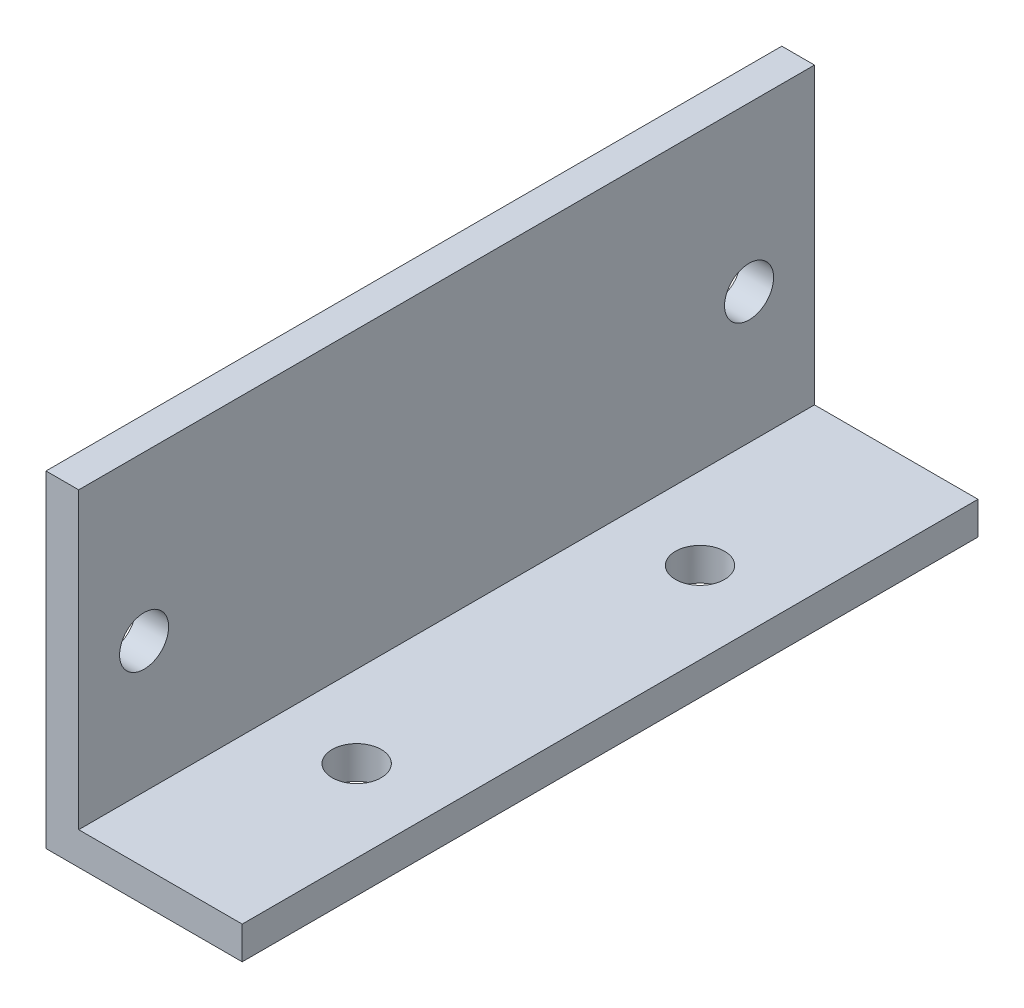
ISO-10303-21;
HEADER;
FILE_DESCRIPTION(('STEP AP214'),'2;1');
FILE_NAME('part.step','',(''),(''),'','','');
FILE_SCHEMA(('AUTOMOTIVE_DESIGN { 1 0 10303 214 1 1 1 1 }'));
ENDSEC;
DATA;
#1=APPLICATION_CONTEXT('core data for automotive mechanical design processes');
#2=APPLICATION_PROTOCOL_DEFINITION('international standard','automotive_design',2000,#1);
#3=PRODUCT_CONTEXT('',#1,'mechanical');
#4=PRODUCT('Part','Part','',(#3));
#5=PRODUCT_RELATED_PRODUCT_CATEGORY('part','',(#4));
#6=PRODUCT_DEFINITION_FORMATION('','',#4);
#7=PRODUCT_DEFINITION_CONTEXT('part definition',#1,'design');
#8=PRODUCT_DEFINITION('design','',#6,#7);
#9=PRODUCT_DEFINITION_SHAPE('','',#8);
#10=(LENGTH_UNIT() NAMED_UNIT(*) SI_UNIT(.MILLI.,.METRE.));
#11=(NAMED_UNIT(*) PLANE_ANGLE_UNIT() SI_UNIT($,.RADIAN.));
#12=(NAMED_UNIT(*) SI_UNIT($,.STERADIAN.) SOLID_ANGLE_UNIT());
#13=UNCERTAINTY_MEASURE_WITH_UNIT(LENGTH_MEASURE(1.E-05),#10,'distance_accuracy_value','');
#14=(GEOMETRIC_REPRESENTATION_CONTEXT(3) GLOBAL_UNCERTAINTY_ASSIGNED_CONTEXT((#13)) GLOBAL_UNIT_ASSIGNED_CONTEXT((#10,
#11,#12)) REPRESENTATION_CONTEXT('',''));
#15=CARTESIAN_POINT('',(0.,0.,0.));
#16=DIRECTION('',(0.,0.,1.));
#17=DIRECTION('',(1.,0.,0.));
#18=AXIS2_PLACEMENT_3D('',#15,#16,#17);
#19=CARTESIAN_POINT('',(-8.16000000000001,-3.80000000000001,45.));
#20=DIRECTION('',(1.,0.,0.));
#21=DIRECTION('',(0.,0.,-1.));
#22=AXIS2_PLACEMENT_3D('',#19,#20,#21);
#23=PLANE('',#22);
#24=CARTESIAN_POINT('',(-8.16000000000001,6.2,41.));
#25=DIRECTION('',(-1.,0.,0.));
#26=DIRECTION('',(0.,0.,-1.));
#27=AXIS2_PLACEMENT_3D('',#24,#25,#26);
#28=CIRCLE('',#27,1.5);
#29=CARTESIAN_POINT('',(-8.16000000000001,6.2,39.5));
#30=VERTEX_POINT('',#29);
#31=EDGE_CURVE('E143',#30,#30,#28,.T.);
#32=ORIENTED_EDGE('',*,*,#31,.F.);
#33=EDGE_LOOP('',(#32));
#34=FACE_BOUND('',#33,.T.);
#35=CARTESIAN_POINT('',(-8.16000000000001,6.19999999999999,4.));
#36=DIRECTION('',(-1.,0.,0.));
#37=DIRECTION('',(0.,0.,1.));
#38=AXIS2_PLACEMENT_3D('',#35,#36,#37);
#39=CIRCLE('',#38,1.5);
#40=CARTESIAN_POINT('',(-8.16000000000001,6.19999999999999,5.5));
#41=VERTEX_POINT('',#40);
#42=EDGE_CURVE('E140',#41,#41,#39,.T.);
#43=ORIENTED_EDGE('',*,*,#42,.F.);
#44=EDGE_LOOP('',(#43));
#45=FACE_BOUND('',#44,.T.);
#46=DIRECTION('',(0.,-1.,0.));
#47=VECTOR('',#46,1.);
#48=CARTESIAN_POINT('',(-8.16000000000001,-3.80000000000001,0.));
#49=LINE('',#48,#47);
#50=CARTESIAN_POINT('',(-8.16000000000001,16.2,0.));
#51=VERTEX_POINT('',#50);
#52=CARTESIAN_POINT('',(-8.16000000000001,-3.80000000000001,0.));
#53=VERTEX_POINT('',#52);
#54=EDGE_CURVE('E121',#51,#53,#49,.T.);
#55=ORIENTED_EDGE('',*,*,#54,.T.);
#56=DIRECTION('',(0.,0.,-1.));
#57=VECTOR('',#56,1.);
#58=CARTESIAN_POINT('',(-8.16000000000001,-3.80000000000001,45.));
#59=LINE('',#58,#57);
#60=CARTESIAN_POINT('',(-8.16000000000001,-3.80000000000001,45.));
#61=VERTEX_POINT('',#60);
#62=EDGE_CURVE('E11',#61,#53,#59,.T.);
#63=ORIENTED_EDGE('',*,*,#62,.F.);
#64=DIRECTION('',(0.,-1.,0.));
#65=VECTOR('',#64,1.);
#66=CARTESIAN_POINT('',(-8.16000000000001,-3.80000000000001,45.));
#67=LINE('',#66,#65);
#68=CARTESIAN_POINT('',(-8.16000000000001,16.2,45.));
#69=VERTEX_POINT('',#68);
#70=EDGE_CURVE('E132',#69,#61,#67,.T.);
#71=ORIENTED_EDGE('',*,*,#70,.F.);
#72=DIRECTION('',(0.,0.,-1.));
#73=VECTOR('',#72,1.);
#74=CARTESIAN_POINT('',(-8.16000000000001,16.2,45.));
#75=LINE('',#74,#73);
#76=EDGE_CURVE('E117',#69,#51,#75,.T.);
#77=ORIENTED_EDGE('',*,*,#76,.T.);
#78=EDGE_LOOP('',(#55,#63,#71,#77));
#79=FACE_BOUND('',#78,.T.);
#80=ADVANCED_FACE('F35',(#34,#45,#79),#23,.F.);
#81=CARTESIAN_POINT('',(3.83999999999999,-3.8,45.));
#82=DIRECTION('',(0.,1.,0.));
#83=DIRECTION('',(-1.,0.,0.));
#84=AXIS2_PLACEMENT_3D('',#81,#82,#83);
#85=PLANE('',#84);
#86=CARTESIAN_POINT('',(-1.16000000000002,-3.8,12.));
#87=DIRECTION('',(0.,-1.,0.));
#88=DIRECTION('',(-1.,0.,0.));
#89=AXIS2_PLACEMENT_3D('',#86,#87,#88);
#90=CIRCLE('',#89,1.5);
#91=CARTESIAN_POINT('',(-2.66000000000002,-3.8,12.));
#92=VERTEX_POINT('',#91);
#93=EDGE_CURVE('E156',#92,#92,#90,.T.);
#94=ORIENTED_EDGE('',*,*,#93,.F.);
#95=EDGE_LOOP('',(#94));
#96=FACE_BOUND('',#95,.T.);
#97=CARTESIAN_POINT('',(-1.16000000000002,-3.8,33.));
#98=DIRECTION('',(0.,-1.,0.));
#99=DIRECTION('',(1.,0.,0.));
#100=AXIS2_PLACEMENT_3D('',#97,#98,#99);
#101=CIRCLE('',#100,1.5);
#102=CARTESIAN_POINT('',(0.339999999999986,-3.8,33.));
#103=VERTEX_POINT('',#102);
#104=EDGE_CURVE('E146',#103,#103,#101,.T.);
#105=ORIENTED_EDGE('',*,*,#104,.F.);
#106=EDGE_LOOP('',(#105));
#107=FACE_BOUND('',#106,.T.);
#108=DIRECTION('',(1.,0.,0.));
#109=VECTOR('',#108,1.);
#110=CARTESIAN_POINT('',(3.83999999999999,-3.8,0.));
#111=LINE('',#110,#109);
#112=CARTESIAN_POINT('',(3.83999999999999,-3.8,0.));
#113=VERTEX_POINT('',#112);
#114=EDGE_CURVE('E124',#53,#113,#111,.T.);
#115=ORIENTED_EDGE('',*,*,#114,.T.);
#116=DIRECTION('',(0.,0.,-1.));
#117=VECTOR('',#116,1.);
#118=CARTESIAN_POINT('',(3.83999999999999,-3.8,45.));
#119=LINE('',#118,#117);
#120=CARTESIAN_POINT('',(3.83999999999999,-3.8,45.));
#121=VERTEX_POINT('',#120);
#122=EDGE_CURVE('E44',#121,#113,#119,.T.);
#123=ORIENTED_EDGE('',*,*,#122,.F.);
#124=DIRECTION('',(1.,0.,0.));
#125=VECTOR('',#124,1.);
#126=CARTESIAN_POINT('',(3.83999999999999,-3.8,45.));
#127=LINE('',#126,#125);
#128=EDGE_CURVE('E90',#61,#121,#127,.T.);
#129=ORIENTED_EDGE('',*,*,#128,.F.);
#130=ORIENTED_EDGE('',*,*,#62,.T.);
#131=EDGE_LOOP('',(#115,#123,#129,#130));
#132=FACE_BOUND('',#131,.T.);
#133=ADVANCED_FACE('F164',(#96,#107,#132),#85,.F.);
#134=CARTESIAN_POINT('',(3.83999999999999,-1.8,45.));
#135=DIRECTION('',(-1.,0.,0.));
#136=DIRECTION('',(0.,-1.,0.));
#137=AXIS2_PLACEMENT_3D('',#134,#135,#136);
#138=PLANE('',#137);
#139=DIRECTION('',(0.,1.,0.));
#140=VECTOR('',#139,1.);
#141=CARTESIAN_POINT('',(3.83999999999999,-1.8,0.));
#142=LINE('',#141,#140);
#143=CARTESIAN_POINT('',(3.83999999999999,-1.8,0.));
#144=VERTEX_POINT('',#143);
#145=EDGE_CURVE('E127',#113,#144,#142,.T.);
#146=ORIENTED_EDGE('',*,*,#145,.T.);
#147=DIRECTION('',(0.,0.,-1.));
#148=VECTOR('',#147,1.);
#149=CARTESIAN_POINT('',(3.83999999999999,-1.8,45.));
#150=LINE('',#149,#148);
#151=CARTESIAN_POINT('',(3.83999999999999,-1.8,45.));
#152=VERTEX_POINT('',#151);
#153=EDGE_CURVE('E112',#152,#144,#150,.T.);
#154=ORIENTED_EDGE('',*,*,#153,.F.);
#155=DIRECTION('',(0.,1.,0.));
#156=VECTOR('',#155,1.);
#157=CARTESIAN_POINT('',(3.83999999999999,-1.8,45.));
#158=LINE('',#157,#156);
#159=EDGE_CURVE('E103',#121,#152,#158,.T.);
#160=ORIENTED_EDGE('',*,*,#159,.F.);
#161=ORIENTED_EDGE('',*,*,#122,.T.);
#162=EDGE_LOOP('',(#146,#154,#160,#161));
#163=FACE_BOUND('',#162,.T.);
#164=ADVANCED_FACE('F167',(#163),#138,.F.);
#165=CARTESIAN_POINT('',(-6.16000000000001,-1.8,45.));
#166=DIRECTION('',(0.,-1.,0.));
#167=DIRECTION('',(1.,0.,0.));
#168=AXIS2_PLACEMENT_3D('',#165,#166,#167);
#169=PLANE('',#168);
#170=CARTESIAN_POINT('',(-1.16000000000002,-1.8,12.));
#171=DIRECTION('',(0.,-1.,0.));
#172=DIRECTION('',(1.,0.,0.));
#173=AXIS2_PLACEMENT_3D('',#170,#171,#172);
#174=CIRCLE('',#173,1.5);
#175=CARTESIAN_POINT('',(0.339999999999985,-1.8,12.));
#176=VERTEX_POINT('',#175);
#177=EDGE_CURVE('E38',#176,#176,#174,.T.);
#178=ORIENTED_EDGE('',*,*,#177,.T.);
#179=EDGE_LOOP('',(#178));
#180=FACE_BOUND('',#179,.T.);
#181=CARTESIAN_POINT('',(-1.16000000000002,-1.8,33.));
#182=DIRECTION('',(0.,-1.,0.));
#183=DIRECTION('',(1.,0.,0.));
#184=AXIS2_PLACEMENT_3D('',#181,#182,#183);
#185=CIRCLE('',#184,1.5);
#186=CARTESIAN_POINT('',(0.339999999999986,-1.8,33.));
#187=VERTEX_POINT('',#186);
#188=EDGE_CURVE('E144',#187,#187,#185,.T.);
#189=ORIENTED_EDGE('',*,*,#188,.T.);
#190=EDGE_LOOP('',(#189));
#191=FACE_BOUND('',#190,.T.);
#192=DIRECTION('',(-1.,0.,0.));
#193=VECTOR('',#192,1.);
#194=CARTESIAN_POINT('',(-6.16000000000001,-1.8,0.));
#195=LINE('',#194,#193);
#196=CARTESIAN_POINT('',(-6.16000000000001,-1.8,0.));
#197=VERTEX_POINT('',#196);
#198=EDGE_CURVE('E111',#144,#197,#195,.T.);
#199=ORIENTED_EDGE('',*,*,#198,.T.);
#200=DIRECTION('',(0.,0.,-1.));
#201=VECTOR('',#200,1.);
#202=CARTESIAN_POINT('',(-6.16000000000001,-1.8,45.));
#203=LINE('',#202,#201);
#204=CARTESIAN_POINT('',(-6.16000000000001,-1.8,45.));
#205=VERTEX_POINT('',#204);
#206=EDGE_CURVE('E108',#205,#197,#203,.T.);
#207=ORIENTED_EDGE('',*,*,#206,.F.);
#208=DIRECTION('',(-1.,0.,0.));
#209=VECTOR('',#208,1.);
#210=CARTESIAN_POINT('',(-6.16000000000001,-1.8,45.));
#211=LINE('',#210,#209);
#212=EDGE_CURVE('E97',#152,#205,#211,.T.);
#213=ORIENTED_EDGE('',*,*,#212,.F.);
#214=ORIENTED_EDGE('',*,*,#153,.T.);
#215=EDGE_LOOP('',(#199,#207,#213,#214));
#216=FACE_BOUND('',#215,.T.);
#217=ADVANCED_FACE('F109',(#180,#191,#216),#169,.F.);
#218=CARTESIAN_POINT('',(-6.16000000000001,16.2,45.));
#219=DIRECTION('',(-1.,0.,0.));
#220=DIRECTION('',(0.,-1.,0.));
#221=AXIS2_PLACEMENT_3D('',#218,#219,#220);
#222=PLANE('',#221);
#223=CARTESIAN_POINT('',(-6.16000000000001,6.2,41.));
#224=DIRECTION('',(-1.,0.,0.));
#225=DIRECTION('',(0.,-1.,0.));
#226=AXIS2_PLACEMENT_3D('',#223,#224,#225);
#227=CIRCLE('',#226,1.5);
#228=CARTESIAN_POINT('',(-6.16000000000001,4.7,41.));
#229=VERTEX_POINT('',#228);
#230=EDGE_CURVE('E141',#229,#229,#227,.T.);
#231=ORIENTED_EDGE('',*,*,#230,.T.);
#232=EDGE_LOOP('',(#231));
#233=FACE_BOUND('',#232,.T.);
#234=CARTESIAN_POINT('',(-6.16000000000001,6.19999999999999,4.));
#235=DIRECTION('',(-1.,0.,0.));
#236=DIRECTION('',(0.,-1.,0.));
#237=AXIS2_PLACEMENT_3D('',#234,#235,#236);
#238=CIRCLE('',#237,1.5);
#239=CARTESIAN_POINT('',(-6.16000000000001,4.69999999999999,4.));
#240=VERTEX_POINT('',#239);
#241=EDGE_CURVE('E125',#240,#240,#238,.T.);
#242=ORIENTED_EDGE('',*,*,#241,.T.);
#243=EDGE_LOOP('',(#242));
#244=FACE_BOUND('',#243,.T.);
#245=DIRECTION('',(0.,1.,0.));
#246=VECTOR('',#245,1.);
#247=CARTESIAN_POINT('',(-6.16000000000001,16.2,0.));
#248=LINE('',#247,#246);
#249=CARTESIAN_POINT('',(-6.16000000000001,16.2,0.));
#250=VERTEX_POINT('',#249);
#251=EDGE_CURVE('E76',#197,#250,#248,.T.);
#252=ORIENTED_EDGE('',*,*,#251,.T.);
#253=DIRECTION('',(0.,0.,-1.));
#254=VECTOR('',#253,1.);
#255=CARTESIAN_POINT('',(-6.16000000000001,16.2,45.));
#256=LINE('',#255,#254);
#257=CARTESIAN_POINT('',(-6.16000000000001,16.2,45.));
#258=VERTEX_POINT('',#257);
#259=EDGE_CURVE('E113',#258,#250,#256,.T.);
#260=ORIENTED_EDGE('',*,*,#259,.F.);
#261=DIRECTION('',(0.,1.,0.));
#262=VECTOR('',#261,1.);
#263=CARTESIAN_POINT('',(-6.16000000000001,16.2,45.));
#264=LINE('',#263,#262);
#265=EDGE_CURVE('E101',#205,#258,#264,.T.);
#266=ORIENTED_EDGE('',*,*,#265,.F.);
#267=ORIENTED_EDGE('',*,*,#206,.T.);
#268=EDGE_LOOP('',(#252,#260,#266,#267));
#269=FACE_BOUND('',#268,.T.);
#270=ADVANCED_FACE('F115',(#233,#244,#269),#222,.F.);
#271=CARTESIAN_POINT('',(-8.16000000000001,16.2,45.));
#272=DIRECTION('',(0.,-1.,0.));
#273=DIRECTION('',(0.,0.,-1.));
#274=AXIS2_PLACEMENT_3D('',#271,#272,#273);
#275=PLANE('',#274);
#276=DIRECTION('',(-1.,0.,0.));
#277=VECTOR('',#276,1.);
#278=CARTESIAN_POINT('',(-8.16000000000001,16.2,0.));
#279=LINE('',#278,#277);
#280=EDGE_CURVE('E82',#250,#51,#279,.T.);
#281=ORIENTED_EDGE('',*,*,#280,.T.);
#282=ORIENTED_EDGE('',*,*,#76,.F.);
#283=DIRECTION('',(-1.,0.,0.));
#284=VECTOR('',#283,1.);
#285=CARTESIAN_POINT('',(-8.16000000000001,16.2,45.));
#286=LINE('',#285,#284);
#287=EDGE_CURVE('E53',#258,#69,#286,.T.);
#288=ORIENTED_EDGE('',*,*,#287,.F.);
#289=ORIENTED_EDGE('',*,*,#259,.T.);
#290=EDGE_LOOP('',(#281,#282,#288,#289));
#291=FACE_BOUND('',#290,.T.);
#292=ADVANCED_FACE('F172',(#291),#275,.F.);
#293=CARTESIAN_POINT('',(0.,0.,45.));
#294=DIRECTION('',(0.,0.,-1.));
#295=DIRECTION('',(-1.,0.,0.));
#296=AXIS2_PLACEMENT_3D('',#293,#294,#295);
#297=PLANE('',#296);
#298=ORIENTED_EDGE('',*,*,#70,.T.);
#299=ORIENTED_EDGE('',*,*,#128,.T.);
#300=ORIENTED_EDGE('',*,*,#159,.T.);
#301=ORIENTED_EDGE('',*,*,#212,.T.);
#302=ORIENTED_EDGE('',*,*,#265,.T.);
#303=ORIENTED_EDGE('',*,*,#287,.T.);
#304=EDGE_LOOP('',(#298,#299,#300,#301,#302,#303));
#305=FACE_BOUND('',#304,.T.);
#306=ADVANCED_FACE('F99',(#305),#297,.F.);
#307=CARTESIAN_POINT('',(0.,0.,0.));
#308=DIRECTION('',(0.,0.,-1.));
#309=DIRECTION('',(-1.,0.,0.));
#310=AXIS2_PLACEMENT_3D('',#307,#308,#309);
#311=PLANE('',#310);
#312=ORIENTED_EDGE('',*,*,#54,.F.);
#313=ORIENTED_EDGE('',*,*,#280,.F.);
#314=ORIENTED_EDGE('',*,*,#251,.F.);
#315=ORIENTED_EDGE('',*,*,#198,.F.);
#316=ORIENTED_EDGE('',*,*,#145,.F.);
#317=ORIENTED_EDGE('',*,*,#114,.F.);
#318=EDGE_LOOP('',(#312,#313,#314,#315,#316,#317));
#319=FACE_BOUND('',#318,.T.);
#320=ADVANCED_FACE('F170',(#319),#311,.T.);
#321=CARTESIAN_POINT('',(3.83999999999999,6.19999999999999,4.));
#322=DIRECTION('',(-1.,0.,0.));
#323=DIRECTION('',(0.,0.,1.));
#324=AXIS2_PLACEMENT_3D('',#321,#322,#323);
#325=CYLINDRICAL_SURFACE('',#324,1.5);
#326=ORIENTED_EDGE('',*,*,#42,.T.);
#327=EDGE_LOOP('',(#326));
#328=FACE_BOUND('',#327,.T.);
#329=ORIENTED_EDGE('',*,*,#241,.F.);
#330=EDGE_LOOP('',(#329));
#331=FACE_BOUND('',#330,.T.);
#332=ADVANCED_FACE('F193',(#328,#331),#325,.F.);
#333=CARTESIAN_POINT('',(3.83999999999999,6.2,41.));
#334=DIRECTION('',(-1.,0.,0.));
#335=DIRECTION('',(0.,0.,1.));
#336=AXIS2_PLACEMENT_3D('',#333,#334,#335);
#337=CYLINDRICAL_SURFACE('',#336,1.5);
#338=ORIENTED_EDGE('',*,*,#31,.T.);
#339=EDGE_LOOP('',(#338));
#340=FACE_BOUND('',#339,.T.);
#341=ORIENTED_EDGE('',*,*,#230,.F.);
#342=EDGE_LOOP('',(#341));
#343=FACE_BOUND('',#342,.T.);
#344=ADVANCED_FACE('F196',(#340,#343),#337,.F.);
#345=CARTESIAN_POINT('',(-1.16000000000002,16.2,33.));
#346=DIRECTION('',(0.,-1.,0.));
#347=DIRECTION('',(1.,0.,0.));
#348=AXIS2_PLACEMENT_3D('',#345,#346,#347);
#349=CYLINDRICAL_SURFACE('',#348,1.5);
#350=ORIENTED_EDGE('',*,*,#104,.T.);
#351=EDGE_LOOP('',(#350));
#352=FACE_BOUND('',#351,.T.);
#353=ORIENTED_EDGE('',*,*,#188,.F.);
#354=EDGE_LOOP('',(#353));
#355=FACE_BOUND('',#354,.T.);
#356=ADVANCED_FACE('F204',(#352,#355),#349,.F.);
#357=CARTESIAN_POINT('',(-1.16000000000002,16.2,12.));
#358=DIRECTION('',(0.,-1.,0.));
#359=DIRECTION('',(1.,0.,0.));
#360=AXIS2_PLACEMENT_3D('',#357,#358,#359);
#361=CYLINDRICAL_SURFACE('',#360,1.5);
#362=ORIENTED_EDGE('',*,*,#93,.T.);
#363=EDGE_LOOP('',(#362));
#364=FACE_BOUND('',#363,.T.);
#365=ORIENTED_EDGE('',*,*,#177,.F.);
#366=EDGE_LOOP('',(#365));
#367=FACE_BOUND('',#366,.T.);
#368=ADVANCED_FACE('F210',(#364,#367),#361,.F.);
#369=CLOSED_SHELL('',(#80,#133,#164,#217,#270,#292,#306,#320,#332,#344,#356,#368));
#370=MANIFOLD_SOLID_BREP('B2',#369);
#371=ADVANCED_BREP_SHAPE_REPRESENTATION('',(#18,#370),#14);
#372=SHAPE_DEFINITION_REPRESENTATION(#9,#371);
ENDSEC;
END-ISO-10303-21;
